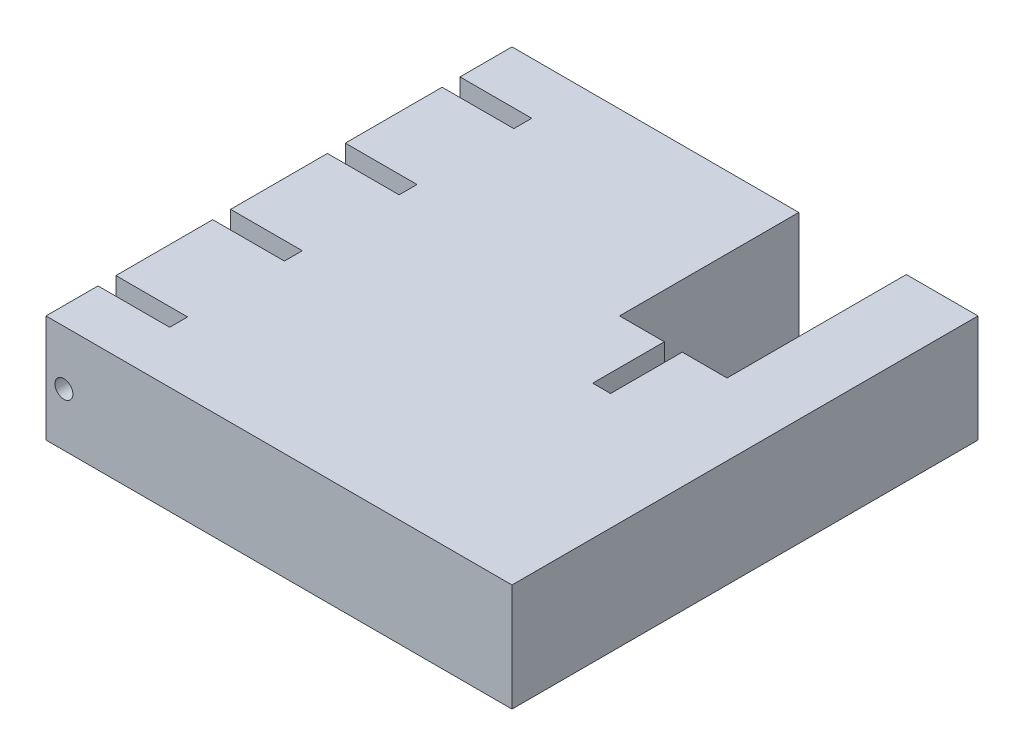
ISO-10303-21;
HEADER;
FILE_DESCRIPTION(('STEP AP214'),'2;1');
FILE_NAME('part.step','',(''),(''),'','','');
FILE_SCHEMA(('AUTOMOTIVE_DESIGN { 1 0 10303 214 1 1 1 1 }'));
ENDSEC;
DATA;
#1=APPLICATION_CONTEXT('core data for automotive mechanical design processes');
#2=APPLICATION_PROTOCOL_DEFINITION('international standard','automotive_design',2000,#1);
#3=PRODUCT_CONTEXT('',#1,'mechanical');
#4=PRODUCT('Part','Part','',(#3));
#5=PRODUCT_RELATED_PRODUCT_CATEGORY('part','',(#4));
#6=PRODUCT_DEFINITION_FORMATION('','',#4);
#7=PRODUCT_DEFINITION_CONTEXT('part definition',#1,'design');
#8=PRODUCT_DEFINITION('design','',#6,#7);
#9=PRODUCT_DEFINITION_SHAPE('','',#8);
#10=(LENGTH_UNIT() NAMED_UNIT(*) SI_UNIT(.MILLI.,.METRE.));
#11=(NAMED_UNIT(*) PLANE_ANGLE_UNIT() SI_UNIT($,.RADIAN.));
#12=(NAMED_UNIT(*) SI_UNIT($,.STERADIAN.) SOLID_ANGLE_UNIT());
#13=UNCERTAINTY_MEASURE_WITH_UNIT(LENGTH_MEASURE(1.E-05),#10,'distance_accuracy_value','');
#14=(GEOMETRIC_REPRESENTATION_CONTEXT(3) GLOBAL_UNCERTAINTY_ASSIGNED_CONTEXT((#13)) GLOBAL_UNIT_ASSIGNED_CONTEXT((#10,
#11,#12)) REPRESENTATION_CONTEXT('',''));
#15=CARTESIAN_POINT('',(0.,0.,0.));
#16=DIRECTION('',(0.,0.,1.));
#17=DIRECTION('',(1.,0.,0.));
#18=AXIS2_PLACEMENT_3D('',#15,#16,#17);
#19=CARTESIAN_POINT('',(-33.4333099605196,0.,31.8483504956141));
#20=DIRECTION('',(0.,0.,1.));
#21=DIRECTION('',(1.,0.,0.));
#22=AXIS2_PLACEMENT_3D('',#19,#20,#21);
#23=PLANE('',#22);
#24=DIRECTION('',(1.,0.,0.));
#25=VECTOR('',#24,1.);
#26=CARTESIAN_POINT('',(-33.4333099605196,0.,31.8483504956141));
#27=LINE('',#26,#25);
#28=CARTESIAN_POINT('',(-15.9333099605197,0.,31.8483504956141));
#29=VERTEX_POINT('',#28);
#30=CARTESIAN_POINT('',(-3.43330996051964,0.,31.8483504956141));
#31=VERTEX_POINT('',#30);
#32=EDGE_CURVE('E64',#29,#31,#27,.T.);
#33=ORIENTED_EDGE('',*,*,#32,.F.);
#34=DIRECTION('',(0.,1.,0.));
#35=VECTOR('',#34,1.);
#36=CARTESIAN_POINT('',(-15.9333099605197,0.,31.8483504956141));
#37=LINE('',#36,#35);
#38=CARTESIAN_POINT('',(-15.9333099605197,30.,31.8483504956141));
#39=VERTEX_POINT('',#38);
#40=EDGE_CURVE('E228',#29,#39,#37,.T.);
#41=ORIENTED_EDGE('',*,*,#40,.T.);
#42=DIRECTION('',(1.,0.,0.));
#43=VECTOR('',#42,1.);
#44=CARTESIAN_POINT('',(0.,30.,31.8483504956141));
#45=LINE('',#44,#43);
#46=CARTESIAN_POINT('',(-3.43330996051964,30.,31.8483504956141));
#47=VERTEX_POINT('',#46);
#48=EDGE_CURVE('E268',#39,#47,#45,.T.);
#49=ORIENTED_EDGE('',*,*,#48,.T.);
#50=DIRECTION('',(0.,1.,0.));
#51=VECTOR('',#50,1.);
#52=CARTESIAN_POINT('',(-3.43330996051964,0.,31.8483504956141));
#53=LINE('',#52,#51);
#54=EDGE_CURVE('E248',#31,#47,#53,.T.);
#55=ORIENTED_EDGE('',*,*,#54,.F.);
#56=EDGE_LOOP('',(#33,#41,#49,#55));
#57=FACE_BOUND('',#56,.T.);
#58=ADVANCED_FACE('F38',(#57),#23,.F.);
#59=CARTESIAN_POINT('',(-113.43330996052,30.,-18.1516495043859));
#60=DIRECTION('',(0.,0.,1.));
#61=DIRECTION('',(1.,0.,0.));
#62=AXIS2_PLACEMENT_3D('',#59,#60,#61);
#63=PLANE('',#62);
#64=CARTESIAN_POINT('',(-108.43330996052,14.8464590407116,-18.1516495043859));
#65=DIRECTION('',(0.,0.,1.));
#66=DIRECTION('',(1.,0.,0.));
#67=AXIS2_PLACEMENT_3D('',#64,#65,#66);
#68=CIRCLE('',#67,2.49999999999999);
#69=CARTESIAN_POINT('',(-105.93330996052,14.8464590407116,-18.1516495043859));
#70=VERTEX_POINT('',#69);
#71=EDGE_CURVE('E288',#70,#70,#68,.T.);
#72=ORIENTED_EDGE('',*,*,#71,.T.);
#73=EDGE_LOOP('',(#72));
#74=FACE_BOUND('',#73,.T.);
#75=DIRECTION('',(-1.,0.,0.));
#76=VECTOR('',#75,1.);
#77=CARTESIAN_POINT('',(-113.43330996052,30.,-18.1516495043859));
#78=LINE('',#77,#76);
#79=CARTESIAN_POINT('',(-33.4333099605196,30.,-18.1516495043859));
#80=VERTEX_POINT('',#79);
#81=CARTESIAN_POINT('',(-113.43330996052,30.,-18.1516495043859));
#82=VERTEX_POINT('',#81);
#83=EDGE_CURVE('E482',#80,#82,#78,.T.);
#84=ORIENTED_EDGE('',*,*,#83,.F.);
#85=DIRECTION('',(0.,1.,0.));
#86=VECTOR('',#85,1.);
#87=CARTESIAN_POINT('',(-33.4333099605196,0.,-18.1516495043859));
#88=LINE('',#87,#86);
#89=CARTESIAN_POINT('',(-33.4333099605196,0.,-18.1516495043859));
#90=VERTEX_POINT('',#89);
#91=EDGE_CURVE('E265',#90,#80,#88,.T.);
#92=ORIENTED_EDGE('',*,*,#91,.F.);
#93=DIRECTION('',(-1.,0.,0.));
#94=VECTOR('',#93,1.);
#95=CARTESIAN_POINT('',(-113.43330996052,0.,-18.1516495043859));
#96=LINE('',#95,#94);
#97=CARTESIAN_POINT('',(-113.43330996052,0.,-18.1516495043859));
#98=VERTEX_POINT('',#97);
#99=EDGE_CURVE('E499',#90,#98,#96,.T.);
#100=ORIENTED_EDGE('',*,*,#99,.T.);
#101=DIRECTION('',(0.,-1.,0.));
#102=VECTOR('',#101,1.);
#103=CARTESIAN_POINT('',(-113.43330996052,30.,-18.1516495043859));
#104=LINE('',#103,#102);
#105=EDGE_CURVE('E487',#82,#98,#104,.T.);
#106=ORIENTED_EDGE('',*,*,#105,.F.);
#107=EDGE_LOOP('',(#84,#92,#100,#106));
#108=FACE_BOUND('',#107,.T.);
#109=ADVANCED_FACE('F602',(#74,#108),#63,.F.);
#110=CARTESIAN_POINT('',(-113.43330996052,30.,-18.1516495043859));
#111=DIRECTION('',(1.,0.,0.));
#112=DIRECTION('',(0.,0.,-1.));
#113=AXIS2_PLACEMENT_3D('',#110,#111,#112);
#114=PLANE('',#113);
#115=DIRECTION('',(0.,0.,1.));
#116=VECTOR('',#115,1.);
#117=CARTESIAN_POINT('',(-113.43330996052,0.,-18.1516495043859));
#118=LINE('',#117,#116);
#119=CARTESIAN_POINT('',(-113.43330996052,0.,1.34835049561411));
#120=VERTEX_POINT('',#119);
#121=CARTESIAN_POINT('',(-113.43330996052,0.,28.3483504956141));
#122=VERTEX_POINT('',#121);
#123=EDGE_CURVE('E493',#120,#122,#118,.T.);
#124=ORIENTED_EDGE('',*,*,#123,.T.);
#125=DIRECTION('',(0.,1.,0.));
#126=VECTOR('',#125,1.);
#127=CARTESIAN_POINT('',(-113.43330996052,0.,28.3483504956141));
#128=LINE('',#127,#126);
#129=CARTESIAN_POINT('',(-113.43330996052,30.,28.3483504956141));
#130=VERTEX_POINT('',#129);
#131=EDGE_CURVE('E340',#122,#130,#128,.T.);
#132=ORIENTED_EDGE('',*,*,#131,.T.);
#133=DIRECTION('',(0.,0.,1.));
#134=VECTOR('',#133,1.);
#135=CARTESIAN_POINT('',(-113.43330996052,30.,-18.1516495043859));
#136=LINE('',#135,#134);
#137=CARTESIAN_POINT('',(-113.43330996052,30.,1.34835049561411));
#138=VERTEX_POINT('',#137);
#139=EDGE_CURVE('E475',#138,#130,#136,.T.);
#140=ORIENTED_EDGE('',*,*,#139,.F.);
#141=DIRECTION('',(0.,1.,0.));
#142=VECTOR('',#141,1.);
#143=CARTESIAN_POINT('',(-113.43330996052,0.,1.34835049561411));
#144=LINE('',#143,#142);
#145=EDGE_CURVE('E445',#120,#138,#144,.T.);
#146=ORIENTED_EDGE('',*,*,#145,.F.);
#147=EDGE_LOOP('',(#124,#132,#140,#146));
#148=FACE_BOUND('',#147,.T.);
#149=ADVANCED_FACE('F607',(#148),#114,.F.);
#150=CARTESIAN_POINT('',(-113.43330996052,30.,33.3483504956141));
#151=VERTEX_POINT('',#150);
#152=CARTESIAN_POINT('',(-113.43330996052,30.,60.3483504956141));
#153=VERTEX_POINT('',#152);
#154=EDGE_CURVE('E545',#151,#153,#136,.T.);
#155=ORIENTED_EDGE('',*,*,#154,.F.);
#156=DIRECTION('',(0.,1.,0.));
#157=VECTOR('',#156,1.);
#158=CARTESIAN_POINT('',(-113.43330996052,0.,33.3483504956141));
#159=LINE('',#158,#157);
#160=CARTESIAN_POINT('',(-113.43330996052,0.,33.3483504956141));
#161=VERTEX_POINT('',#160);
#162=EDGE_CURVE('E339',#161,#151,#159,.T.);
#163=ORIENTED_EDGE('',*,*,#162,.F.);
#164=CARTESIAN_POINT('',(-113.43330996052,0.,60.3483504956141));
#165=VERTEX_POINT('',#164);
#166=EDGE_CURVE('E547',#161,#165,#118,.T.);
#167=ORIENTED_EDGE('',*,*,#166,.T.);
#168=DIRECTION('',(0.,1.,0.));
#169=VECTOR('',#168,1.);
#170=CARTESIAN_POINT('',(-113.43330996052,0.,60.3483504956141));
#171=LINE('',#170,#169);
#172=EDGE_CURVE('E331',#165,#153,#171,.T.);
#173=ORIENTED_EDGE('',*,*,#172,.T.);
#174=EDGE_LOOP('',(#155,#163,#167,#173));
#175=FACE_BOUND('',#174,.T.);
#176=ADVANCED_FACE('F543',(#175),#114,.F.);
#177=CARTESIAN_POINT('',(-113.43330996052,30.,65.3483504956141));
#178=VERTEX_POINT('',#177);
#179=CARTESIAN_POINT('',(-113.43330996052,30.,92.3483504956141));
#180=VERTEX_POINT('',#179);
#181=EDGE_CURVE('E552',#178,#180,#136,.T.);
#182=ORIENTED_EDGE('',*,*,#181,.F.);
#183=DIRECTION('',(0.,1.,0.));
#184=VECTOR('',#183,1.);
#185=CARTESIAN_POINT('',(-113.43330996052,0.,65.3483504956141));
#186=LINE('',#185,#184);
#187=CARTESIAN_POINT('',(-113.43330996052,0.,65.3483504956141));
#188=VERTEX_POINT('',#187);
#189=EDGE_CURVE('E368',#188,#178,#186,.T.);
#190=ORIENTED_EDGE('',*,*,#189,.F.);
#191=CARTESIAN_POINT('',(-113.43330996052,0.,92.3483504956141));
#192=VERTEX_POINT('',#191);
#193=EDGE_CURVE('E575',#188,#192,#118,.T.);
#194=ORIENTED_EDGE('',*,*,#193,.T.);
#195=DIRECTION('',(0.,1.,0.));
#196=VECTOR('',#195,1.);
#197=CARTESIAN_POINT('',(-113.43330996052,0.,92.3483504956141));
#198=LINE('',#197,#196);
#199=EDGE_CURVE('E360',#192,#180,#198,.T.);
#200=ORIENTED_EDGE('',*,*,#199,.T.);
#201=EDGE_LOOP('',(#182,#190,#194,#200));
#202=FACE_BOUND('',#201,.T.);
#203=ADVANCED_FACE('F671',(#202),#114,.F.);
#204=CARTESIAN_POINT('',(-113.43330996052,0.,-3.6516495043859));
#205=VERTEX_POINT('',#204);
#206=EDGE_CURVE('E488',#98,#205,#118,.T.);
#207=ORIENTED_EDGE('',*,*,#206,.T.);
#208=DIRECTION('',(0.,1.,0.));
#209=VECTOR('',#208,1.);
#210=CARTESIAN_POINT('',(-113.43330996052,0.,-3.6516495043859));
#211=LINE('',#210,#209);
#212=CARTESIAN_POINT('',(-113.43330996052,30.,-3.6516495043859));
#213=VERTEX_POINT('',#212);
#214=EDGE_CURVE('E446',#205,#213,#211,.T.);
#215=ORIENTED_EDGE('',*,*,#214,.T.);
#216=EDGE_CURVE('E470',#82,#213,#136,.T.);
#217=ORIENTED_EDGE('',*,*,#216,.F.);
#218=ORIENTED_EDGE('',*,*,#105,.T.);
#219=EDGE_LOOP('',(#207,#215,#217,#218));
#220=FACE_BOUND('',#219,.T.);
#221=ADVANCED_FACE('F665',(#220),#114,.F.);
#222=CARTESIAN_POINT('',(-113.43330996052,30.,97.3483504956141));
#223=VERTEX_POINT('',#222);
#224=CARTESIAN_POINT('',(-113.43330996052,30.,111.848350495614));
#225=VERTEX_POINT('',#224);
#226=EDGE_CURVE('E476',#223,#225,#136,.T.);
#227=ORIENTED_EDGE('',*,*,#226,.F.);
#228=DIRECTION('',(0.,1.,0.));
#229=VECTOR('',#228,1.);
#230=CARTESIAN_POINT('',(-113.43330996052,0.,97.3483504956141));
#231=LINE('',#230,#229);
#232=CARTESIAN_POINT('',(-113.43330996052,0.,97.3483504956141));
#233=VERTEX_POINT('',#232);
#234=EDGE_CURVE('E393',#233,#223,#231,.T.);
#235=ORIENTED_EDGE('',*,*,#234,.F.);
#236=CARTESIAN_POINT('',(-113.43330996052,0.,111.848350495614));
#237=VERTEX_POINT('',#236);
#238=EDGE_CURVE('E469',#233,#237,#118,.T.);
#239=ORIENTED_EDGE('',*,*,#238,.T.);
#240=DIRECTION('',(0.,-1.,0.));
#241=VECTOR('',#240,1.);
#242=CARTESIAN_POINT('',(-113.43330996052,30.,111.848350495614));
#243=LINE('',#242,#241);
#244=EDGE_CURVE('E11',#225,#237,#243,.T.);
#245=ORIENTED_EDGE('',*,*,#244,.F.);
#246=EDGE_LOOP('',(#227,#235,#239,#245));
#247=FACE_BOUND('',#246,.T.);
#248=ADVANCED_FACE('F40',(#247),#114,.F.);
#249=CARTESIAN_POINT('',(-113.43330996052,30.,111.848350495614));
#250=DIRECTION('',(0.,0.,-1.));
#251=DIRECTION('',(-1.,0.,0.));
#252=AXIS2_PLACEMENT_3D('',#249,#250,#251);
#253=PLANE('',#252);
#254=CARTESIAN_POINT('',(-108.43330996052,14.8464590407116,111.848350495614));
#255=DIRECTION('',(0.,0.,-1.));
#256=DIRECTION('',(-1.,0.,0.));
#257=AXIS2_PLACEMENT_3D('',#254,#255,#256);
#258=CIRCLE('',#257,2.49999999999999);
#259=CARTESIAN_POINT('',(-110.93330996052,14.8464590407116,111.848350495614));
#260=VERTEX_POINT('',#259);
#261=EDGE_CURVE('E321',#260,#260,#258,.T.);
#262=ORIENTED_EDGE('',*,*,#261,.T.);
#263=EDGE_LOOP('',(#262));
#264=FACE_BOUND('',#263,.T.);
#265=DIRECTION('',(1.,0.,0.));
#266=VECTOR('',#265,1.);
#267=CARTESIAN_POINT('',(-113.43330996052,0.,111.848350495614));
#268=LINE('',#267,#266);
#269=CARTESIAN_POINT('',(16.5666900394804,0.,111.848350495614));
#270=VERTEX_POINT('',#269);
#271=EDGE_CURVE('E492',#237,#270,#268,.T.);
#272=ORIENTED_EDGE('',*,*,#271,.T.);
#273=DIRECTION('',(0.,-1.,0.));
#274=VECTOR('',#273,1.);
#275=CARTESIAN_POINT('',(16.5666900394804,30.,111.848350495614));
#276=LINE('',#275,#274);
#277=CARTESIAN_POINT('',(16.5666900394804,30.,111.848350495614));
#278=VERTEX_POINT('',#277);
#279=EDGE_CURVE('E48',#278,#270,#276,.T.);
#280=ORIENTED_EDGE('',*,*,#279,.F.);
#281=DIRECTION('',(1.,0.,0.));
#282=VECTOR('',#281,1.);
#283=CARTESIAN_POINT('',(-113.43330996052,30.,111.848350495614));
#284=LINE('',#283,#282);
#285=EDGE_CURVE('E474',#225,#278,#284,.T.);
#286=ORIENTED_EDGE('',*,*,#285,.F.);
#287=ORIENTED_EDGE('',*,*,#244,.T.);
#288=EDGE_LOOP('',(#272,#280,#286,#287));
#289=FACE_BOUND('',#288,.T.);
#290=ADVANCED_FACE('F570',(#264,#289),#253,.F.);
#291=CARTESIAN_POINT('',(16.5666900394803,30.,-18.1516495043859));
#292=DIRECTION('',(-1.,0.,0.));
#293=DIRECTION('',(0.,0.,1.));
#294=AXIS2_PLACEMENT_3D('',#291,#292,#293);
#295=PLANE('',#294);
#296=DIRECTION('',(0.,0.,-1.));
#297=VECTOR('',#296,1.);
#298=CARTESIAN_POINT('',(16.5666900394803,0.,-18.1516495043859));
#299=LINE('',#298,#297);
#300=CARTESIAN_POINT('',(16.5666900394803,0.,-18.1516495043859));
#301=VERTEX_POINT('',#300);
#302=EDGE_CURVE('E496',#270,#301,#299,.T.);
#303=ORIENTED_EDGE('',*,*,#302,.T.);
#304=DIRECTION('',(0.,-1.,0.));
#305=VECTOR('',#304,1.);
#306=CARTESIAN_POINT('',(16.5666900394803,30.,-18.1516495043859));
#307=LINE('',#306,#305);
#308=CARTESIAN_POINT('',(16.5666900394803,30.,-18.1516495043859));
#309=VERTEX_POINT('',#308);
#310=EDGE_CURVE('E507',#309,#301,#307,.T.);
#311=ORIENTED_EDGE('',*,*,#310,.F.);
#312=DIRECTION('',(0.,0.,-1.));
#313=VECTOR('',#312,1.);
#314=CARTESIAN_POINT('',(16.5666900394803,30.,-18.1516495043859));
#315=LINE('',#314,#313);
#316=EDGE_CURVE('E479',#278,#309,#315,.T.);
#317=ORIENTED_EDGE('',*,*,#316,.F.);
#318=ORIENTED_EDGE('',*,*,#279,.T.);
#319=EDGE_LOOP('',(#303,#311,#317,#318));
#320=FACE_BOUND('',#319,.T.);
#321=ADVANCED_FACE('F579',(#320),#295,.F.);
#322=CARTESIAN_POINT('',(-3.43330996051964,0.,-18.1516495043859));
#323=VERTEX_POINT('',#322);
#324=EDGE_CURVE('E500',#301,#323,#96,.T.);
#325=ORIENTED_EDGE('',*,*,#324,.T.);
#326=DIRECTION('',(0.,1.,0.));
#327=VECTOR('',#326,1.);
#328=CARTESIAN_POINT('',(-3.43330996051964,0.,-18.1516495043859));
#329=LINE('',#328,#327);
#330=CARTESIAN_POINT('',(-3.43330996051964,30.,-18.1516495043859));
#331=VERTEX_POINT('',#330);
#332=EDGE_CURVE('E269',#323,#331,#329,.T.);
#333=ORIENTED_EDGE('',*,*,#332,.T.);
#334=EDGE_CURVE('E483',#309,#331,#78,.T.);
#335=ORIENTED_EDGE('',*,*,#334,.F.);
#336=ORIENTED_EDGE('',*,*,#310,.T.);
#337=EDGE_LOOP('',(#325,#333,#335,#336));
#338=FACE_BOUND('',#337,.T.);
#339=ADVANCED_FACE('F584',(#338),#63,.F.);
#340=CARTESIAN_POINT('',(0.,30.,0.));
#341=DIRECTION('',(0.,1.,0.));
#342=DIRECTION('',(0.,0.,1.));
#343=AXIS2_PLACEMENT_3D('',#340,#341,#342);
#344=PLANE('',#343);
#345=DIRECTION('',(0.,0.,-1.));
#346=VECTOR('',#345,1.);
#347=CARTESIAN_POINT('',(-15.9333099605196,30.,0.));
#348=LINE('',#347,#346);
#349=CARTESIAN_POINT('',(-15.9333099605197,30.,51.8483504956141));
#350=VERTEX_POINT('',#349);
#351=EDGE_CURVE('E234',#350,#39,#348,.T.);
#352=ORIENTED_EDGE('',*,*,#351,.F.);
#353=DIRECTION('',(1.,0.,0.));
#354=VECTOR('',#353,1.);
#355=CARTESIAN_POINT('',(0.,30.,51.8483504956141));
#356=LINE('',#355,#354);
#357=CARTESIAN_POINT('',(-20.9333099605196,30.,51.8483504956141));
#358=VERTEX_POINT('',#357);
#359=EDGE_CURVE('E258',#358,#350,#356,.T.);
#360=ORIENTED_EDGE('',*,*,#359,.F.);
#361=DIRECTION('',(0.,0.,1.));
#362=VECTOR('',#361,1.);
#363=CARTESIAN_POINT('',(-20.9333099605196,30.,0.));
#364=LINE('',#363,#362);
#365=CARTESIAN_POINT('',(-20.9333099605196,30.,31.8483504956141));
#366=VERTEX_POINT('',#365);
#367=EDGE_CURVE('E727',#366,#358,#364,.T.);
#368=ORIENTED_EDGE('',*,*,#367,.F.);
#369=CARTESIAN_POINT('',(-33.4333099605196,30.,31.8483504956141));
#370=VERTEX_POINT('',#369);
#371=EDGE_CURVE('E278',#370,#366,#45,.T.);
#372=ORIENTED_EDGE('',*,*,#371,.F.);
#373=DIRECTION('',(0.,0.,1.));
#374=VECTOR('',#373,1.);
#375=CARTESIAN_POINT('',(-33.4333099605196,30.,0.));
#376=LINE('',#375,#374);
#377=EDGE_CURVE('E285',#80,#370,#376,.T.);
#378=ORIENTED_EDGE('',*,*,#377,.F.);
#379=ORIENTED_EDGE('',*,*,#83,.T.);
#380=ORIENTED_EDGE('',*,*,#216,.T.);
#381=DIRECTION('',(-1.,0.,0.));
#382=VECTOR('',#381,1.);
#383=CARTESIAN_POINT('',(0.,30.,-3.6516495043859));
#384=LINE('',#383,#382);
#385=CARTESIAN_POINT('',(-93.4333099605197,30.,-3.6516495043859));
#386=VERTEX_POINT('',#385);
#387=EDGE_CURVE('E466',#386,#213,#384,.T.);
#388=ORIENTED_EDGE('',*,*,#387,.F.);
#389=DIRECTION('',(0.,0.,-1.));
#390=VECTOR('',#389,1.);
#391=CARTESIAN_POINT('',(-93.4333099605197,30.,0.));
#392=LINE('',#391,#390);
#393=CARTESIAN_POINT('',(-93.4333099605197,30.,1.34835049561411));
#394=VERTEX_POINT('',#393);
#395=EDGE_CURVE('E463',#394,#386,#392,.T.);
#396=ORIENTED_EDGE('',*,*,#395,.F.);
#397=DIRECTION('',(1.,0.,0.));
#398=VECTOR('',#397,1.);
#399=CARTESIAN_POINT('',(0.,30.,1.34835049561411));
#400=LINE('',#399,#398);
#401=EDGE_CURVE('E450',#138,#394,#400,.T.);
#402=ORIENTED_EDGE('',*,*,#401,.F.);
#403=ORIENTED_EDGE('',*,*,#139,.T.);
#404=DIRECTION('',(-1.,0.,0.));
#405=VECTOR('',#404,1.);
#406=CARTESIAN_POINT('',(0.,30.,28.3483504956141));
#407=LINE('',#406,#405);
#408=CARTESIAN_POINT('',(-93.4333099605197,30.,28.3483504956141));
#409=VERTEX_POINT('',#408);
#410=EDGE_CURVE('E430',#409,#130,#407,.T.);
#411=ORIENTED_EDGE('',*,*,#410,.F.);
#412=DIRECTION('',(0.,0.,-1.));
#413=VECTOR('',#412,1.);
#414=CARTESIAN_POINT('',(-93.4333099605197,30.,0.));
#415=LINE('',#414,#413);
#416=CARTESIAN_POINT('',(-93.4333099605197,30.,33.3483504956141));
#417=VERTEX_POINT('',#416);
#418=EDGE_CURVE('E427',#417,#409,#415,.T.);
#419=ORIENTED_EDGE('',*,*,#418,.F.);
#420=DIRECTION('',(1.,0.,0.));
#421=VECTOR('',#420,1.);
#422=CARTESIAN_POINT('',(0.,30.,33.3483504956141));
#423=LINE('',#422,#421);
#424=EDGE_CURVE('E424',#151,#417,#423,.T.);
#425=ORIENTED_EDGE('',*,*,#424,.F.);
#426=ORIENTED_EDGE('',*,*,#154,.T.);
#427=DIRECTION('',(-1.,0.,0.));
#428=VECTOR('',#427,1.);
#429=CARTESIAN_POINT('',(0.,30.,60.3483504956141));
#430=LINE('',#429,#428);
#431=CARTESIAN_POINT('',(-93.4333099605197,30.,60.3483504956141));
#432=VERTEX_POINT('',#431);
#433=EDGE_CURVE('E421',#432,#153,#430,.T.);
#434=ORIENTED_EDGE('',*,*,#433,.F.);
#435=DIRECTION('',(0.,0.,-1.));
#436=VECTOR('',#435,1.);
#437=CARTESIAN_POINT('',(-93.4333099605195,30.,-2.59329529962769E-13));
#438=LINE('',#437,#436);
#439=CARTESIAN_POINT('',(-93.4333099605197,30.,65.3483504956141));
#440=VERTEX_POINT('',#439);
#441=EDGE_CURVE('E418',#440,#432,#438,.T.);
#442=ORIENTED_EDGE('',*,*,#441,.F.);
#443=DIRECTION('',(1.,0.,0.));
#444=VECTOR('',#443,1.);
#445=CARTESIAN_POINT('',(0.,30.,65.3483504956141));
#446=LINE('',#445,#444);
#447=EDGE_CURVE('E415',#178,#440,#446,.T.);
#448=ORIENTED_EDGE('',*,*,#447,.F.);
#449=ORIENTED_EDGE('',*,*,#181,.T.);
#450=DIRECTION('',(-1.,0.,0.));
#451=VECTOR('',#450,1.);
#452=CARTESIAN_POINT('',(0.,30.,92.348350495614));
#453=LINE('',#452,#451);
#454=CARTESIAN_POINT('',(-93.4333099605197,30.,92.3483504956141));
#455=VERTEX_POINT('',#454);
#456=EDGE_CURVE('E412',#455,#180,#453,.T.);
#457=ORIENTED_EDGE('',*,*,#456,.F.);
#458=DIRECTION('',(0.,0.,-1.));
#459=VECTOR('',#458,1.);
#460=CARTESIAN_POINT('',(-93.4333099605197,30.,0.));
#461=LINE('',#460,#459);
#462=CARTESIAN_POINT('',(-93.4333099605197,30.,97.3483504956141));
#463=VERTEX_POINT('',#462);
#464=EDGE_CURVE('E409',#463,#455,#461,.T.);
#465=ORIENTED_EDGE('',*,*,#464,.F.);
#466=DIRECTION('',(1.,0.,0.));
#467=VECTOR('',#466,1.);
#468=CARTESIAN_POINT('',(0.,30.,97.3483504956141));
#469=LINE('',#468,#467);
#470=EDGE_CURVE('E344',#223,#463,#469,.T.);
#471=ORIENTED_EDGE('',*,*,#470,.F.);
#472=ORIENTED_EDGE('',*,*,#226,.T.);
#473=ORIENTED_EDGE('',*,*,#285,.T.);
#474=ORIENTED_EDGE('',*,*,#316,.T.);
#475=ORIENTED_EDGE('',*,*,#334,.T.);
#476=DIRECTION('',(0.,0.,-1.));
#477=VECTOR('',#476,1.);
#478=CARTESIAN_POINT('',(-3.43330996051964,30.,0.));
#479=LINE('',#478,#477);
#480=EDGE_CURVE('E282',#47,#331,#479,.T.);
#481=ORIENTED_EDGE('',*,*,#480,.F.);
#482=ORIENTED_EDGE('',*,*,#48,.F.);
#483=EDGE_LOOP('',(#352,#360,#368,#372,#378,#379,#380,#388,#396,#402,#403,#411,#419,#425,#426,
#434,#442,#448,#449,#457,#465,#471,#472,#473,#474,#475,#481,#482));
#484=FACE_BOUND('',#483,.T.);
#485=ADVANCED_FACE('F549',(#484),#344,.T.);
#486=CARTESIAN_POINT('',(0.,0.,0.));
#487=DIRECTION('',(0.,1.,0.));
#488=DIRECTION('',(0.,0.,1.));
#489=AXIS2_PLACEMENT_3D('',#486,#487,#488);
#490=PLANE('',#489);
#491=DIRECTION('',(1.,0.,0.));
#492=VECTOR('',#491,1.);
#493=CARTESIAN_POINT('',(-15.9333099605197,0.,51.8483504956141));
#494=LINE('',#493,#492);
#495=CARTESIAN_POINT('',(-20.9333099605196,0.,51.8483504956141));
#496=VERTEX_POINT('',#495);
#497=CARTESIAN_POINT('',(-15.9333099605197,0.,51.8483504956141));
#498=VERTEX_POINT('',#497);
#499=EDGE_CURVE('E239',#496,#498,#494,.T.);
#500=ORIENTED_EDGE('',*,*,#499,.T.);
#501=DIRECTION('',(0.,0.,-1.));
#502=VECTOR('',#501,1.);
#503=CARTESIAN_POINT('',(-15.9333099605197,0.,51.8483504956141));
#504=LINE('',#503,#502);
#505=EDGE_CURVE('E231',#498,#29,#504,.T.);
#506=ORIENTED_EDGE('',*,*,#505,.T.);
#507=ORIENTED_EDGE('',*,*,#32,.T.);
#508=DIRECTION('',(0.,0.,-1.));
#509=VECTOR('',#508,1.);
#510=CARTESIAN_POINT('',(-3.43330996051964,0.,-18.1516495043859));
#511=LINE('',#510,#509);
#512=EDGE_CURVE('E256',#31,#323,#511,.T.);
#513=ORIENTED_EDGE('',*,*,#512,.T.);
#514=ORIENTED_EDGE('',*,*,#324,.F.);
#515=ORIENTED_EDGE('',*,*,#302,.F.);
#516=ORIENTED_EDGE('',*,*,#271,.F.);
#517=ORIENTED_EDGE('',*,*,#238,.F.);
#518=DIRECTION('',(1.,0.,0.));
#519=VECTOR('',#518,1.);
#520=CARTESIAN_POINT('',(-113.43330996052,0.,97.3483504956141));
#521=LINE('',#520,#519);
#522=CARTESIAN_POINT('',(-93.4333099605197,0.,97.3483504956141));
#523=VERTEX_POINT('',#522);
#524=EDGE_CURVE('E325',#233,#523,#521,.T.);
#525=ORIENTED_EDGE('',*,*,#524,.T.);
#526=DIRECTION('',(0.,0.,-1.));
#527=VECTOR('',#526,1.);
#528=CARTESIAN_POINT('',(-93.4333099605197,0.,92.3483504956141));
#529=LINE('',#528,#527);
#530=CARTESIAN_POINT('',(-93.4333099605197,0.,92.3483504956141));
#531=VERTEX_POINT('',#530);
#532=EDGE_CURVE('E385',#523,#531,#529,.T.);
#533=ORIENTED_EDGE('',*,*,#532,.T.);
#534=DIRECTION('',(-1.,0.,0.));
#535=VECTOR('',#534,1.);
#536=CARTESIAN_POINT('',(-113.43330996052,0.,92.3483504956141));
#537=LINE('',#536,#535);
#538=EDGE_CURVE('E389',#531,#192,#537,.T.);
#539=ORIENTED_EDGE('',*,*,#538,.T.);
#540=ORIENTED_EDGE('',*,*,#193,.F.);
#541=DIRECTION('',(1.,0.,0.));
#542=VECTOR('',#541,1.);
#543=CARTESIAN_POINT('',(-113.43330996052,0.,65.3483504956141));
#544=LINE('',#543,#542);
#545=CARTESIAN_POINT('',(-93.4333099605197,0.,65.3483504956141));
#546=VERTEX_POINT('',#545);
#547=EDGE_CURVE('E355',#188,#546,#544,.T.);
#548=ORIENTED_EDGE('',*,*,#547,.T.);
#549=DIRECTION('',(0.,0.,-1.));
#550=VECTOR('',#549,1.);
#551=CARTESIAN_POINT('',(-93.4333099605197,0.,60.3483504956141));
#552=LINE('',#551,#550);
#553=CARTESIAN_POINT('',(-93.4333099605197,0.,60.3483504956141));
#554=VERTEX_POINT('',#553);
#555=EDGE_CURVE('E359',#546,#554,#552,.T.);
#556=ORIENTED_EDGE('',*,*,#555,.T.);
#557=DIRECTION('',(-1.,0.,0.));
#558=VECTOR('',#557,1.);
#559=CARTESIAN_POINT('',(-113.43330996052,0.,60.3483504956141));
#560=LINE('',#559,#558);
#561=EDGE_CURVE('E364',#554,#165,#560,.T.);
#562=ORIENTED_EDGE('',*,*,#561,.T.);
#563=ORIENTED_EDGE('',*,*,#166,.F.);
#564=DIRECTION('',(1.,0.,0.));
#565=VECTOR('',#564,1.);
#566=CARTESIAN_POINT('',(-113.43330996052,0.,33.3483504956141));
#567=LINE('',#566,#565);
#568=CARTESIAN_POINT('',(-93.4333099605197,0.,33.3483504956141));
#569=VERTEX_POINT('',#568);
#570=EDGE_CURVE('E326',#161,#569,#567,.T.);
#571=ORIENTED_EDGE('',*,*,#570,.T.);
#572=DIRECTION('',(0.,0.,-1.));
#573=VECTOR('',#572,1.);
#574=CARTESIAN_POINT('',(-93.4333099605197,0.,28.3483504956141));
#575=LINE('',#574,#573);
#576=CARTESIAN_POINT('',(-93.4333099605197,0.,28.3483504956141));
#577=VERTEX_POINT('',#576);
#578=EDGE_CURVE('E330',#569,#577,#575,.T.);
#579=ORIENTED_EDGE('',*,*,#578,.T.);
#580=DIRECTION('',(-1.,0.,0.));
#581=VECTOR('',#580,1.);
#582=CARTESIAN_POINT('',(-113.43330996052,0.,28.3483504956141));
#583=LINE('',#582,#581);
#584=EDGE_CURVE('E335',#577,#122,#583,.T.);
#585=ORIENTED_EDGE('',*,*,#584,.T.);
#586=ORIENTED_EDGE('',*,*,#123,.F.);
#587=DIRECTION('',(1.,0.,0.));
#588=VECTOR('',#587,1.);
#589=CARTESIAN_POINT('',(-113.43330996052,0.,1.34835049561411));
#590=LINE('',#589,#588);
#591=CARTESIAN_POINT('',(-93.4333099605197,0.,1.34835049561411));
#592=VERTEX_POINT('',#591);
#593=EDGE_CURVE('E433',#120,#592,#590,.T.);
#594=ORIENTED_EDGE('',*,*,#593,.T.);
#595=DIRECTION('',(0.,0.,-1.));
#596=VECTOR('',#595,1.);
#597=CARTESIAN_POINT('',(-93.4333099605197,0.,-3.6516495043859));
#598=LINE('',#597,#596);
#599=CARTESIAN_POINT('',(-93.4333099605197,0.,-3.6516495043859));
#600=VERTEX_POINT('',#599);
#601=EDGE_CURVE('E437',#592,#600,#598,.T.);
#602=ORIENTED_EDGE('',*,*,#601,.T.);
#603=DIRECTION('',(-1.,0.,0.));
#604=VECTOR('',#603,1.);
#605=CARTESIAN_POINT('',(-113.43330996052,0.,-3.6516495043859));
#606=LINE('',#605,#604);
#607=EDGE_CURVE('E441',#600,#205,#606,.T.);
#608=ORIENTED_EDGE('',*,*,#607,.T.);
#609=ORIENTED_EDGE('',*,*,#206,.F.);
#610=ORIENTED_EDGE('',*,*,#99,.F.);
#611=DIRECTION('',(0.,0.,1.));
#612=VECTOR('',#611,1.);
#613=CARTESIAN_POINT('',(-33.4333099605196,0.,-18.1516495043859));
#614=LINE('',#613,#612);
#615=CARTESIAN_POINT('',(-33.4333099605196,0.,31.8483504956141));
#616=VERTEX_POINT('',#615);
#617=EDGE_CURVE('E251',#90,#616,#614,.T.);
#618=ORIENTED_EDGE('',*,*,#617,.T.);
#619=CARTESIAN_POINT('',(-20.9333099605197,0.,31.8483504956141));
#620=VERTEX_POINT('',#619);
#621=EDGE_CURVE('E250',#616,#620,#27,.T.);
#622=ORIENTED_EDGE('',*,*,#621,.T.);
#623=DIRECTION('',(0.,0.,1.));
#624=VECTOR('',#623,1.);
#625=CARTESIAN_POINT('',(-20.9333099605196,0.,51.8483504956141));
#626=LINE('',#625,#624);
#627=EDGE_CURVE('E56',#620,#496,#626,.T.);
#628=ORIENTED_EDGE('',*,*,#627,.T.);
#629=EDGE_LOOP('',(#500,#506,#507,#513,#514,#515,#516,#517,#525,#533,#539,#540,#548,#556,#562,
#563,#571,#579,#585,#586,#594,#602,#608,#609,#610,#618,#622,#628));
#630=FACE_BOUND('',#629,.T.);
#631=ADVANCED_FACE('F241',(#630),#490,.F.);
#632=CARTESIAN_POINT('',(-113.43330996052,0.,-3.6516495043859));
#633=DIRECTION('',(0.,0.,-1.));
#634=DIRECTION('',(-1.,0.,0.));
#635=AXIS2_PLACEMENT_3D('',#632,#633,#634);
#636=PLANE('',#635);
#637=CARTESIAN_POINT('',(-108.43330996052,14.8464590407116,-3.6516495043859));
#638=DIRECTION('',(0.,0.,-1.));
#639=DIRECTION('',(-1.,0.,0.));
#640=AXIS2_PLACEMENT_3D('',#637,#638,#639);
#641=CIRCLE('',#640,2.49999999999999);
#642=CARTESIAN_POINT('',(-110.93330996052,14.8464590407116,-3.6516495043859));
#643=VERTEX_POINT('',#642);
#644=EDGE_CURVE('E317',#643,#643,#641,.T.);
#645=ORIENTED_EDGE('',*,*,#644,.T.);
#646=EDGE_LOOP('',(#645));
#647=FACE_BOUND('',#646,.T.);
#648=ORIENTED_EDGE('',*,*,#387,.T.);
#649=ORIENTED_EDGE('',*,*,#214,.F.);
#650=ORIENTED_EDGE('',*,*,#607,.F.);
#651=DIRECTION('',(0.,1.,0.));
#652=VECTOR('',#651,1.);
#653=CARTESIAN_POINT('',(-93.4333099605197,0.,-3.6516495043859));
#654=LINE('',#653,#652);
#655=EDGE_CURVE('E451',#600,#386,#654,.T.);
#656=ORIENTED_EDGE('',*,*,#655,.T.);
#657=EDGE_LOOP('',(#648,#649,#650,#656));
#658=FACE_BOUND('',#657,.T.);
#659=ADVANCED_FACE('F642',(#647,#658),#636,.F.);
#660=CARTESIAN_POINT('',(-93.4333099605197,0.,-3.6516495043859));
#661=DIRECTION('',(1.,0.,0.));
#662=DIRECTION('',(0.,0.,-1.));
#663=AXIS2_PLACEMENT_3D('',#660,#661,#662);
#664=PLANE('',#663);
#665=ORIENTED_EDGE('',*,*,#395,.T.);
#666=ORIENTED_EDGE('',*,*,#655,.F.);
#667=ORIENTED_EDGE('',*,*,#601,.F.);
#668=DIRECTION('',(0.,1.,0.));
#669=VECTOR('',#668,1.);
#670=CARTESIAN_POINT('',(-93.4333099605197,0.,1.34835049561411));
#671=LINE('',#670,#669);
#672=EDGE_CURVE('E455',#592,#394,#671,.T.);
#673=ORIENTED_EDGE('',*,*,#672,.T.);
#674=EDGE_LOOP('',(#665,#666,#667,#673));
#675=FACE_BOUND('',#674,.T.);
#676=ADVANCED_FACE('F645',(#675),#664,.F.);
#677=CARTESIAN_POINT('',(-113.43330996052,0.,1.34835049561411));
#678=DIRECTION('',(0.,0.,1.));
#679=DIRECTION('',(1.,0.,0.));
#680=AXIS2_PLACEMENT_3D('',#677,#678,#679);
#681=PLANE('',#680);
#682=CARTESIAN_POINT('',(-108.43330996052,14.8464590407116,1.3483504956141));
#683=DIRECTION('',(0.,0.,1.));
#684=DIRECTION('',(1.,0.,0.));
#685=AXIS2_PLACEMENT_3D('',#682,#683,#684);
#686=CIRCLE('',#685,2.49999999999999);
#687=CARTESIAN_POINT('',(-105.93330996052,14.8464590407116,1.3483504956141));
#688=VERTEX_POINT('',#687);
#689=EDGE_CURVE('E313',#688,#688,#686,.T.);
#690=ORIENTED_EDGE('',*,*,#689,.T.);
#691=EDGE_LOOP('',(#690));
#692=FACE_BOUND('',#691,.T.);
#693=ORIENTED_EDGE('',*,*,#401,.T.);
#694=ORIENTED_EDGE('',*,*,#672,.F.);
#695=ORIENTED_EDGE('',*,*,#593,.F.);
#696=ORIENTED_EDGE('',*,*,#145,.T.);
#697=EDGE_LOOP('',(#693,#694,#695,#696));
#698=FACE_BOUND('',#697,.T.);
#699=ADVANCED_FACE('F634',(#692,#698),#681,.F.);
#700=CARTESIAN_POINT('',(-113.43330996052,0.,92.3483504956141));
#701=DIRECTION('',(0.,0.,-1.));
#702=DIRECTION('',(-1.,0.,0.));
#703=AXIS2_PLACEMENT_3D('',#700,#701,#702);
#704=PLANE('',#703);
#705=CARTESIAN_POINT('',(-108.43330996052,14.8464590407116,92.3483504956141));
#706=DIRECTION('',(0.,0.,-1.));
#707=DIRECTION('',(-1.,0.,0.));
#708=AXIS2_PLACEMENT_3D('',#705,#706,#707);
#709=CIRCLE('',#708,2.49999999999999);
#710=CARTESIAN_POINT('',(-110.93330996052,14.8464590407116,92.3483504956141));
#711=VERTEX_POINT('',#710);
#712=EDGE_CURVE('E309',#711,#711,#709,.T.);
#713=ORIENTED_EDGE('',*,*,#712,.T.);
#714=EDGE_LOOP('',(#713));
#715=FACE_BOUND('',#714,.T.);
#716=ORIENTED_EDGE('',*,*,#456,.T.);
#717=ORIENTED_EDGE('',*,*,#199,.F.);
#718=ORIENTED_EDGE('',*,*,#538,.F.);
#719=DIRECTION('',(0.,1.,0.));
#720=VECTOR('',#719,1.);
#721=CARTESIAN_POINT('',(-93.4333099605197,0.,92.3483504956141));
#722=LINE('',#721,#720);
#723=EDGE_CURVE('E397',#531,#455,#722,.T.);
#724=ORIENTED_EDGE('',*,*,#723,.T.);
#725=EDGE_LOOP('',(#716,#717,#718,#724));
#726=FACE_BOUND('',#725,.T.);
#727=ADVANCED_FACE('F630',(#715,#726),#704,.F.);
#728=CARTESIAN_POINT('',(-93.4333099605197,0.,92.3483504956141));
#729=DIRECTION('',(1.,0.,0.));
#730=DIRECTION('',(0.,0.,-1.));
#731=AXIS2_PLACEMENT_3D('',#728,#729,#730);
#732=PLANE('',#731);
#733=ORIENTED_EDGE('',*,*,#464,.T.);
#734=ORIENTED_EDGE('',*,*,#723,.F.);
#735=ORIENTED_EDGE('',*,*,#532,.F.);
#736=DIRECTION('',(0.,1.,0.));
#737=VECTOR('',#736,1.);
#738=CARTESIAN_POINT('',(-93.4333099605197,0.,97.3483504956141));
#739=LINE('',#738,#737);
#740=EDGE_CURVE('E401',#523,#463,#739,.T.);
#741=ORIENTED_EDGE('',*,*,#740,.T.);
#742=EDGE_LOOP('',(#733,#734,#735,#741));
#743=FACE_BOUND('',#742,.T.);
#744=ADVANCED_FACE('F633',(#743),#732,.F.);
#745=CARTESIAN_POINT('',(-113.43330996052,0.,97.3483504956141));
#746=DIRECTION('',(0.,0.,1.));
#747=DIRECTION('',(1.,0.,0.));
#748=AXIS2_PLACEMENT_3D('',#745,#746,#747);
#749=PLANE('',#748);
#750=CARTESIAN_POINT('',(-108.43330996052,14.8464590407116,97.3483504956141));
#751=DIRECTION('',(0.,0.,1.));
#752=DIRECTION('',(1.,0.,0.));
#753=AXIS2_PLACEMENT_3D('',#750,#751,#752);
#754=CIRCLE('',#753,2.49999999999999);
#755=CARTESIAN_POINT('',(-105.93330996052,14.8464590407116,97.3483504956141));
#756=VERTEX_POINT('',#755);
#757=EDGE_CURVE('E305',#756,#756,#754,.T.);
#758=ORIENTED_EDGE('',*,*,#757,.T.);
#759=EDGE_LOOP('',(#758));
#760=FACE_BOUND('',#759,.T.);
#761=ORIENTED_EDGE('',*,*,#470,.T.);
#762=ORIENTED_EDGE('',*,*,#740,.F.);
#763=ORIENTED_EDGE('',*,*,#524,.F.);
#764=ORIENTED_EDGE('',*,*,#234,.T.);
#765=EDGE_LOOP('',(#761,#762,#763,#764));
#766=FACE_BOUND('',#765,.T.);
#767=ADVANCED_FACE('F533',(#760,#766),#749,.F.);
#768=CARTESIAN_POINT('',(-113.43330996052,0.,60.3483504956141));
#769=DIRECTION('',(0.,0.,-1.));
#770=DIRECTION('',(-1.,0.,0.));
#771=AXIS2_PLACEMENT_3D('',#768,#769,#770);
#772=PLANE('',#771);
#773=CARTESIAN_POINT('',(-108.43330996052,14.8464590407116,60.3483504956141));
#774=DIRECTION('',(0.,0.,-1.));
#775=DIRECTION('',(-1.,0.,0.));
#776=AXIS2_PLACEMENT_3D('',#773,#774,#775);
#777=CIRCLE('',#776,2.49999999999999);
#778=CARTESIAN_POINT('',(-110.93330996052,14.8464590407116,60.3483504956141));
#779=VERTEX_POINT('',#778);
#780=EDGE_CURVE('E301',#779,#779,#777,.T.);
#781=ORIENTED_EDGE('',*,*,#780,.T.);
#782=EDGE_LOOP('',(#781));
#783=FACE_BOUND('',#782,.T.);
#784=ORIENTED_EDGE('',*,*,#433,.T.);
#785=ORIENTED_EDGE('',*,*,#172,.F.);
#786=ORIENTED_EDGE('',*,*,#561,.F.);
#787=DIRECTION('',(0.,1.,0.));
#788=VECTOR('',#787,1.);
#789=CARTESIAN_POINT('',(-93.4333099605197,0.,60.3483504956141));
#790=LINE('',#789,#788);
#791=EDGE_CURVE('E372',#554,#432,#790,.T.);
#792=ORIENTED_EDGE('',*,*,#791,.T.);
#793=EDGE_LOOP('',(#784,#785,#786,#792));
#794=FACE_BOUND('',#793,.T.);
#795=ADVANCED_FACE('F529',(#783,#794),#772,.F.);
#796=CARTESIAN_POINT('',(-93.4333099605197,0.,60.3483504956141));
#797=DIRECTION('',(1.,0.,0.));
#798=DIRECTION('',(0.,0.,-1.));
#799=AXIS2_PLACEMENT_3D('',#796,#797,#798);
#800=PLANE('',#799);
#801=ORIENTED_EDGE('',*,*,#441,.T.);
#802=ORIENTED_EDGE('',*,*,#791,.F.);
#803=ORIENTED_EDGE('',*,*,#555,.F.);
#804=DIRECTION('',(0.,1.,0.));
#805=VECTOR('',#804,1.);
#806=CARTESIAN_POINT('',(-93.4333099605197,0.,65.3483504956141));
#807=LINE('',#806,#805);
#808=EDGE_CURVE('E376',#546,#440,#807,.T.);
#809=ORIENTED_EDGE('',*,*,#808,.T.);
#810=EDGE_LOOP('',(#801,#802,#803,#809));
#811=FACE_BOUND('',#810,.T.);
#812=ADVANCED_FACE('F532',(#811),#800,.F.);
#813=CARTESIAN_POINT('',(-113.43330996052,0.,65.3483504956141));
#814=DIRECTION('',(0.,0.,1.));
#815=DIRECTION('',(1.,0.,0.));
#816=AXIS2_PLACEMENT_3D('',#813,#814,#815);
#817=PLANE('',#816);
#818=CARTESIAN_POINT('',(-108.43330996052,14.8464590407116,65.3483504956141));
#819=DIRECTION('',(0.,0.,1.));
#820=DIRECTION('',(1.,0.,0.));
#821=AXIS2_PLACEMENT_3D('',#818,#819,#820);
#822=CIRCLE('',#821,2.49999999999999);
#823=CARTESIAN_POINT('',(-105.93330996052,14.8464590407116,65.3483504956141));
#824=VERTEX_POINT('',#823);
#825=EDGE_CURVE('E297',#824,#824,#822,.T.);
#826=ORIENTED_EDGE('',*,*,#825,.T.);
#827=EDGE_LOOP('',(#826));
#828=FACE_BOUND('',#827,.T.);
#829=ORIENTED_EDGE('',*,*,#447,.T.);
#830=ORIENTED_EDGE('',*,*,#808,.F.);
#831=ORIENTED_EDGE('',*,*,#547,.F.);
#832=ORIENTED_EDGE('',*,*,#189,.T.);
#833=EDGE_LOOP('',(#829,#830,#831,#832));
#834=FACE_BOUND('',#833,.T.);
#835=ADVANCED_FACE('F617',(#828,#834),#817,.F.);
#836=CARTESIAN_POINT('',(-113.43330996052,0.,28.3483504956141));
#837=DIRECTION('',(0.,0.,-1.));
#838=DIRECTION('',(-1.,0.,0.));
#839=AXIS2_PLACEMENT_3D('',#836,#837,#838);
#840=PLANE('',#839);
#841=CARTESIAN_POINT('',(-108.43330996052,14.8464590407116,28.3483504956141));
#842=DIRECTION('',(0.,0.,-1.));
#843=DIRECTION('',(-1.,0.,0.));
#844=AXIS2_PLACEMENT_3D('',#841,#842,#843);
#845=CIRCLE('',#844,2.49999999999999);
#846=CARTESIAN_POINT('',(-110.93330996052,14.8464590407116,28.3483504956141));
#847=VERTEX_POINT('',#846);
#848=EDGE_CURVE('E293',#847,#847,#845,.T.);
#849=ORIENTED_EDGE('',*,*,#848,.T.);
#850=EDGE_LOOP('',(#849));
#851=FACE_BOUND('',#850,.T.);
#852=ORIENTED_EDGE('',*,*,#410,.T.);
#853=ORIENTED_EDGE('',*,*,#131,.F.);
#854=ORIENTED_EDGE('',*,*,#584,.F.);
#855=DIRECTION('',(0.,1.,0.));
#856=VECTOR('',#855,1.);
#857=CARTESIAN_POINT('',(-93.4333099605197,0.,28.3483504956141));
#858=LINE('',#857,#856);
#859=EDGE_CURVE('E345',#577,#409,#858,.T.);
#860=ORIENTED_EDGE('',*,*,#859,.T.);
#861=EDGE_LOOP('',(#852,#853,#854,#860));
#862=FACE_BOUND('',#861,.T.);
#863=ADVANCED_FACE('F613',(#851,#862),#840,.F.);
#864=CARTESIAN_POINT('',(-93.4333099605197,0.,28.3483504956141));
#865=DIRECTION('',(1.,0.,0.));
#866=DIRECTION('',(0.,0.,-1.));
#867=AXIS2_PLACEMENT_3D('',#864,#865,#866);
#868=PLANE('',#867);
#869=ORIENTED_EDGE('',*,*,#418,.T.);
#870=ORIENTED_EDGE('',*,*,#859,.F.);
#871=ORIENTED_EDGE('',*,*,#578,.F.);
#872=DIRECTION('',(0.,1.,0.));
#873=VECTOR('',#872,1.);
#874=CARTESIAN_POINT('',(-93.4333099605197,0.,33.3483504956141));
#875=LINE('',#874,#873);
#876=EDGE_CURVE('E349',#569,#417,#875,.T.);
#877=ORIENTED_EDGE('',*,*,#876,.T.);
#878=EDGE_LOOP('',(#869,#870,#871,#877));
#879=FACE_BOUND('',#878,.T.);
#880=ADVANCED_FACE('F616',(#879),#868,.F.);
#881=CARTESIAN_POINT('',(-113.43330996052,0.,33.3483504956141));
#882=DIRECTION('',(0.,0.,1.));
#883=DIRECTION('',(1.,0.,0.));
#884=AXIS2_PLACEMENT_3D('',#881,#882,#883);
#885=PLANE('',#884);
#886=CARTESIAN_POINT('',(-108.43330996052,14.8464590407116,33.3483504956141));
#887=DIRECTION('',(0.,0.,1.));
#888=DIRECTION('',(1.,0.,0.));
#889=AXIS2_PLACEMENT_3D('',#886,#887,#888);
#890=CIRCLE('',#889,2.49999999999999);
#891=CARTESIAN_POINT('',(-105.93330996052,14.8464590407116,33.3483504956141));
#892=VERTEX_POINT('',#891);
#893=EDGE_CURVE('E292',#892,#892,#890,.T.);
#894=ORIENTED_EDGE('',*,*,#893,.T.);
#895=EDGE_LOOP('',(#894));
#896=FACE_BOUND('',#895,.T.);
#897=ORIENTED_EDGE('',*,*,#424,.T.);
#898=ORIENTED_EDGE('',*,*,#876,.F.);
#899=ORIENTED_EDGE('',*,*,#570,.F.);
#900=ORIENTED_EDGE('',*,*,#162,.T.);
#901=EDGE_LOOP('',(#897,#898,#899,#900));
#902=FACE_BOUND('',#901,.T.);
#903=ADVANCED_FACE('F517',(#896,#902),#885,.F.);
#904=CARTESIAN_POINT('',(-108.43330996052,14.8464590407116,-18.1516495043859));
#905=DIRECTION('',(0.,0.,1.));
#906=DIRECTION('',(1.,0.,0.));
#907=AXIS2_PLACEMENT_3D('',#904,#905,#906);
#908=CYLINDRICAL_SURFACE('',#907,2.49999999999999);
#909=ORIENTED_EDGE('',*,*,#893,.F.);
#910=EDGE_LOOP('',(#909));
#911=FACE_BOUND('',#910,.T.);
#912=ORIENTED_EDGE('',*,*,#780,.F.);
#913=EDGE_LOOP('',(#912));
#914=FACE_BOUND('',#913,.T.);
#915=ADVANCED_FACE('F520',(#911,#914),#908,.F.);
#916=ORIENTED_EDGE('',*,*,#848,.F.);
#917=EDGE_LOOP('',(#916));
#918=FACE_BOUND('',#917,.T.);
#919=ORIENTED_EDGE('',*,*,#689,.F.);
#920=EDGE_LOOP('',(#919));
#921=FACE_BOUND('',#920,.T.);
#922=ADVANCED_FACE('F523',(#918,#921),#908,.F.);
#923=ORIENTED_EDGE('',*,*,#825,.F.);
#924=EDGE_LOOP('',(#923));
#925=FACE_BOUND('',#924,.T.);
#926=ORIENTED_EDGE('',*,*,#712,.F.);
#927=EDGE_LOOP('',(#926));
#928=FACE_BOUND('',#927,.T.);
#929=ADVANCED_FACE('F526',(#925,#928),#908,.F.);
#930=ORIENTED_EDGE('',*,*,#757,.F.);
#931=EDGE_LOOP('',(#930));
#932=FACE_BOUND('',#931,.T.);
#933=ORIENTED_EDGE('',*,*,#261,.F.);
#934=EDGE_LOOP('',(#933));
#935=FACE_BOUND('',#934,.T.);
#936=ADVANCED_FACE('F525',(#932,#935),#908,.F.);
#937=ORIENTED_EDGE('',*,*,#71,.F.);
#938=EDGE_LOOP('',(#937));
#939=FACE_BOUND('',#938,.T.);
#940=ORIENTED_EDGE('',*,*,#644,.F.);
#941=EDGE_LOOP('',(#940));
#942=FACE_BOUND('',#941,.T.);
#943=ADVANCED_FACE('F597',(#939,#942),#908,.F.);
#944=CARTESIAN_POINT('',(-33.4333099605196,0.,-18.1516495043859));
#945=DIRECTION('',(-1.,0.,0.));
#946=DIRECTION('',(0.,0.,1.));
#947=AXIS2_PLACEMENT_3D('',#944,#945,#946);
#948=PLANE('',#947);
#949=ORIENTED_EDGE('',*,*,#377,.T.);
#950=DIRECTION('',(0.,1.,0.));
#951=VECTOR('',#950,1.);
#952=CARTESIAN_POINT('',(-33.4333099605196,0.,31.8483504956141));
#953=LINE('',#952,#951);
#954=EDGE_CURVE('E264',#616,#370,#953,.T.);
#955=ORIENTED_EDGE('',*,*,#954,.F.);
#956=ORIENTED_EDGE('',*,*,#617,.F.);
#957=ORIENTED_EDGE('',*,*,#91,.T.);
#958=EDGE_LOOP('',(#949,#955,#956,#957));
#959=FACE_BOUND('',#958,.T.);
#960=ADVANCED_FACE('F589',(#959),#948,.F.);
#961=CARTESIAN_POINT('',(-3.43330996051964,0.,-18.1516495043859));
#962=DIRECTION('',(1.,0.,0.));
#963=DIRECTION('',(0.,0.,-1.));
#964=AXIS2_PLACEMENT_3D('',#961,#962,#963);
#965=PLANE('',#964);
#966=ORIENTED_EDGE('',*,*,#480,.T.);
#967=ORIENTED_EDGE('',*,*,#332,.F.);
#968=ORIENTED_EDGE('',*,*,#512,.F.);
#969=ORIENTED_EDGE('',*,*,#54,.T.);
#970=EDGE_LOOP('',(#966,#967,#968,#969));
#971=FACE_BOUND('',#970,.T.);
#972=ADVANCED_FACE('F586',(#971),#965,.F.);
#973=ORIENTED_EDGE('',*,*,#371,.T.);
#974=DIRECTION('',(0.,1.,0.));
#975=VECTOR('',#974,1.);
#976=CARTESIAN_POINT('',(-20.9333099605196,0.,31.8483504956141));
#977=LINE('',#976,#975);
#978=EDGE_CURVE('E238',#620,#366,#977,.T.);
#979=ORIENTED_EDGE('',*,*,#978,.F.);
#980=ORIENTED_EDGE('',*,*,#621,.F.);
#981=ORIENTED_EDGE('',*,*,#954,.T.);
#982=EDGE_LOOP('',(#973,#979,#980,#981));
#983=FACE_BOUND('',#982,.T.);
#984=ADVANCED_FACE('F588',(#983),#23,.F.);
#985=CARTESIAN_POINT('',(-15.9333099605197,0.,51.8483504956141));
#986=DIRECTION('',(1.,0.,0.));
#987=DIRECTION('',(0.,0.,-1.));
#988=AXIS2_PLACEMENT_3D('',#985,#986,#987);
#989=PLANE('',#988);
#990=CARTESIAN_POINT('',(-15.9333099605197,12.774309840438,46.8483504956141));
#991=DIRECTION('',(1.,0.,0.));
#992=DIRECTION('',(0.,0.,-1.));
#993=AXIS2_PLACEMENT_3D('',#990,#991,#992);
#994=CIRCLE('',#993,2.5);
#995=CARTESIAN_POINT('',(-15.9333099605197,12.774309840438,44.3483504956141));
#996=VERTEX_POINT('',#995);
#997=EDGE_CURVE('E244',#996,#996,#994,.F.);
#998=ORIENTED_EDGE('',*,*,#997,.F.);
#999=EDGE_LOOP('',(#998));
#1000=FACE_BOUND('',#999,.T.);
#1001=ORIENTED_EDGE('',*,*,#351,.T.);
#1002=ORIENTED_EDGE('',*,*,#40,.F.);
#1003=ORIENTED_EDGE('',*,*,#505,.F.);
#1004=DIRECTION('',(0.,1.,0.));
#1005=VECTOR('',#1004,1.);
#1006=CARTESIAN_POINT('',(-15.9333099605197,0.,51.8483504956141));
#1007=LINE('',#1006,#1005);
#1008=EDGE_CURVE('E723',#498,#350,#1007,.T.);
#1009=ORIENTED_EDGE('',*,*,#1008,.T.);
#1010=EDGE_LOOP('',(#1001,#1002,#1003,#1009));
#1011=FACE_BOUND('',#1010,.T.);
#1012=ADVANCED_FACE('F229',(#1000,#1011),#989,.F.);
#1013=CARTESIAN_POINT('',(-15.9333099605197,0.,51.8483504956141));
#1014=DIRECTION('',(0.,0.,1.));
#1015=DIRECTION('',(1.,0.,0.));
#1016=AXIS2_PLACEMENT_3D('',#1013,#1014,#1015);
#1017=PLANE('',#1016);
#1018=ORIENTED_EDGE('',*,*,#359,.T.);
#1019=ORIENTED_EDGE('',*,*,#1008,.F.);
#1020=ORIENTED_EDGE('',*,*,#499,.F.);
#1021=DIRECTION('',(0.,1.,0.));
#1022=VECTOR('',#1021,1.);
#1023=CARTESIAN_POINT('',(-20.9333099605196,0.,51.8483504956141));
#1024=LINE('',#1023,#1022);
#1025=EDGE_CURVE('E719',#496,#358,#1024,.T.);
#1026=ORIENTED_EDGE('',*,*,#1025,.T.);
#1027=EDGE_LOOP('',(#1018,#1019,#1020,#1026));
#1028=FACE_BOUND('',#1027,.T.);
#1029=ADVANCED_FACE('F734',(#1028),#1017,.F.);
#1030=CARTESIAN_POINT('',(-20.9333099605196,0.,51.8483504956141));
#1031=DIRECTION('',(-1.,0.,0.));
#1032=DIRECTION('',(0.,0.,1.));
#1033=AXIS2_PLACEMENT_3D('',#1030,#1031,#1032);
#1034=PLANE('',#1033);
#1035=CARTESIAN_POINT('',(-20.9333099605196,12.774309840438,46.8483504956141));
#1036=DIRECTION('',(-1.,0.,0.));
#1037=DIRECTION('',(0.,0.,1.));
#1038=AXIS2_PLACEMENT_3D('',#1035,#1036,#1037);
#1039=CIRCLE('',#1038,2.5);
#1040=CARTESIAN_POINT('',(-20.9333099605196,12.774309840438,49.3483504956141));
#1041=VERTEX_POINT('',#1040);
#1042=EDGE_CURVE('E42',#1041,#1041,#1039,.F.);
#1043=ORIENTED_EDGE('',*,*,#1042,.F.);
#1044=EDGE_LOOP('',(#1043));
#1045=FACE_BOUND('',#1044,.T.);
#1046=ORIENTED_EDGE('',*,*,#367,.T.);
#1047=ORIENTED_EDGE('',*,*,#1025,.F.);
#1048=ORIENTED_EDGE('',*,*,#627,.F.);
#1049=ORIENTED_EDGE('',*,*,#978,.T.);
#1050=EDGE_LOOP('',(#1046,#1047,#1048,#1049));
#1051=FACE_BOUND('',#1050,.T.);
#1052=ADVANCED_FACE('F765',(#1045,#1051),#1034,.F.);
#1053=CARTESIAN_POINT('',(-30.9333099605196,12.774309840438,46.8483504956141));
#1054=DIRECTION('',(1.,0.,0.));
#1055=DIRECTION('',(0.,0.,-1.));
#1056=AXIS2_PLACEMENT_3D('',#1053,#1054,#1055);
#1057=PLANE('',#1056);
#1058=CARTESIAN_POINT('',(-30.9333099605196,12.774309840438,46.8483504956141));
#1059=DIRECTION('',(1.,0.,0.));
#1060=DIRECTION('',(0.,0.,-1.));
#1061=AXIS2_PLACEMENT_3D('',#1058,#1059,#1060);
#1062=CIRCLE('',#1061,2.5);
#1063=CARTESIAN_POINT('',(-30.9333099605196,12.774309840438,44.3483504956141));
#1064=VERTEX_POINT('',#1063);
#1065=EDGE_CURVE('E749',#1064,#1064,#1062,.T.);
#1066=ORIENTED_EDGE('',*,*,#1065,.T.);
#1067=EDGE_LOOP('',(#1066));
#1068=FACE_BOUND('',#1067,.T.);
#1069=ADVANCED_FACE('F754',(#1068),#1057,.T.);
#1070=CARTESIAN_POINT('',(-10.9333099605196,12.774309840438,46.8483504956141));
#1071=DIRECTION('',(-1.,0.,0.));
#1072=DIRECTION('',(0.,0.,1.));
#1073=AXIS2_PLACEMENT_3D('',#1070,#1071,#1072);
#1074=CYLINDRICAL_SURFACE('',#1073,2.5);
#1075=ORIENTED_EDGE('',*,*,#1065,.F.);
#1076=EDGE_LOOP('',(#1075));
#1077=FACE_BOUND('',#1076,.T.);
#1078=ORIENTED_EDGE('',*,*,#1042,.T.);
#1079=EDGE_LOOP('',(#1078));
#1080=FACE_BOUND('',#1079,.T.);
#1081=ADVANCED_FACE('F756',(#1077,#1080),#1074,.F.);
#1082=CARTESIAN_POINT('',(-10.9333099605196,12.774309840438,46.8483504956141));
#1083=DIRECTION('',(1.,0.,0.));
#1084=DIRECTION('',(0.,0.,-1.));
#1085=AXIS2_PLACEMENT_3D('',#1082,#1083,#1084);
#1086=CIRCLE('',#1085,2.5);
#1087=CARTESIAN_POINT('',(-10.9333099605196,12.774309840438,44.3483504956141));
#1088=VERTEX_POINT('',#1087);
#1089=EDGE_CURVE('E745',#1088,#1088,#1086,.T.);
#1090=ORIENTED_EDGE('',*,*,#1089,.T.);
#1091=EDGE_LOOP('',(#1090));
#1092=FACE_BOUND('',#1091,.T.);
#1093=ORIENTED_EDGE('',*,*,#997,.T.);
#1094=EDGE_LOOP('',(#1093));
#1095=FACE_BOUND('',#1094,.T.);
#1096=ADVANCED_FACE('F759',(#1092,#1095),#1074,.F.);
#1097=CARTESIAN_POINT('',(-10.9333099605196,12.774309840438,46.8483504956141));
#1098=DIRECTION('',(1.,0.,0.));
#1099=DIRECTION('',(0.,0.,-1.));
#1100=AXIS2_PLACEMENT_3D('',#1097,#1098,#1099);
#1101=PLANE('',#1100);
#1102=ORIENTED_EDGE('',*,*,#1089,.F.);
#1103=EDGE_LOOP('',(#1102));
#1104=FACE_BOUND('',#1103,.T.);
#1105=ADVANCED_FACE('F782',(#1104),#1101,.F.);
#1106=CLOSED_SHELL('',(#58,#109,#149,#176,#203,#221,#248,#290,#321,#339,#485,#631,#659,#676,
#699,#727,#744,#767,#795,#812,#835,#863,#880,#903,#915,#922,#929,#936,#943,#960,#972,#984,#1012,
#1029,#1052,#1069,#1081,#1096,#1105));
#1107=MANIFOLD_SOLID_BREP('B2',#1106);
#1108=ADVANCED_BREP_SHAPE_REPRESENTATION('',(#18,#1107),#14);
#1109=SHAPE_DEFINITION_REPRESENTATION(#9,#1108);
ENDSEC;
END-ISO-10303-21;
